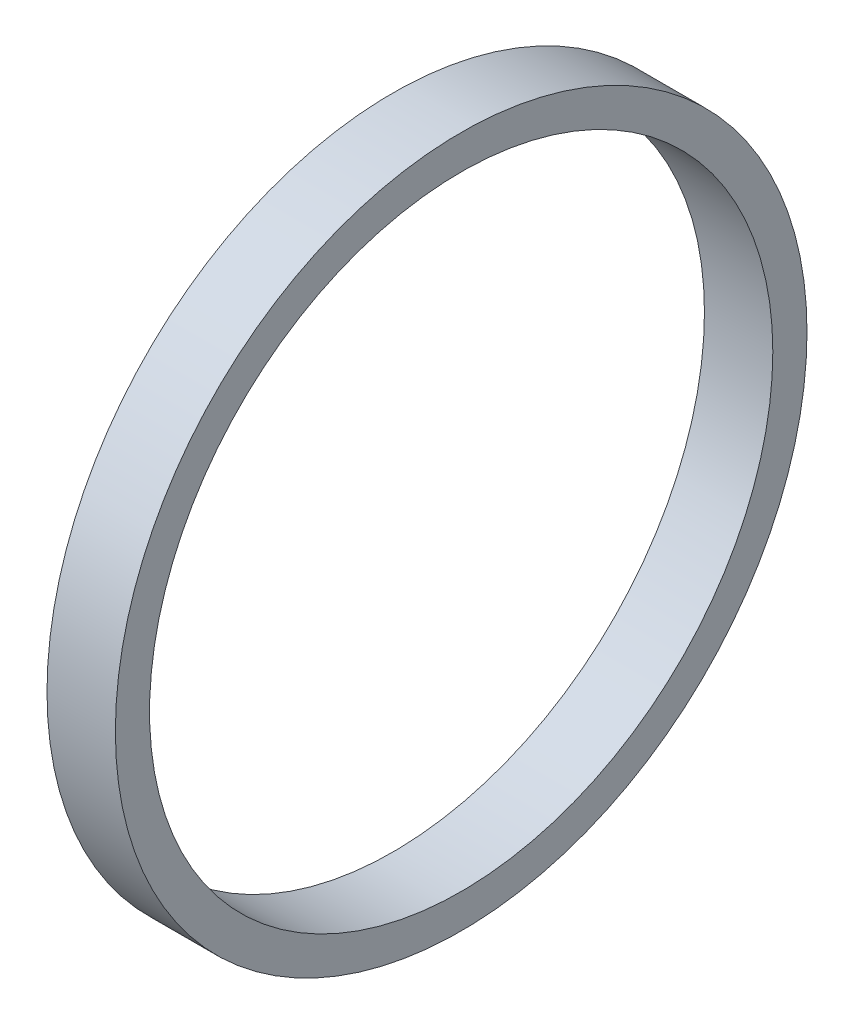
ISO-10303-21;
HEADER;
FILE_DESCRIPTION(('STEP AP214'),'2;1');
FILE_NAME('part.step','',(''),(''),'','','');
FILE_SCHEMA(('AUTOMOTIVE_DESIGN { 1 0 10303 214 1 1 1 1 }'));
ENDSEC;
DATA;
#1=APPLICATION_CONTEXT('core data for automotive mechanical design processes');
#2=APPLICATION_PROTOCOL_DEFINITION('international standard','automotive_design',2000,#1);
#3=PRODUCT_CONTEXT('',#1,'mechanical');
#4=PRODUCT('Part','Part','',(#3));
#5=PRODUCT_RELATED_PRODUCT_CATEGORY('part','',(#4));
#6=PRODUCT_DEFINITION_FORMATION('','',#4);
#7=PRODUCT_DEFINITION_CONTEXT('part definition',#1,'design');
#8=PRODUCT_DEFINITION('design','',#6,#7);
#9=PRODUCT_DEFINITION_SHAPE('','',#8);
#10=(LENGTH_UNIT() NAMED_UNIT(*) SI_UNIT(.MILLI.,.METRE.));
#11=(NAMED_UNIT(*) PLANE_ANGLE_UNIT() SI_UNIT($,.RADIAN.));
#12=(NAMED_UNIT(*) SI_UNIT($,.STERADIAN.) SOLID_ANGLE_UNIT());
#13=UNCERTAINTY_MEASURE_WITH_UNIT(LENGTH_MEASURE(1.E-05),#10,'distance_accuracy_value','');
#14=(GEOMETRIC_REPRESENTATION_CONTEXT(3) GLOBAL_UNCERTAINTY_ASSIGNED_CONTEXT((#13)) GLOBAL_UNIT_ASSIGNED_CONTEXT((#10,
#11,#12)) REPRESENTATION_CONTEXT('',''));
#15=CARTESIAN_POINT('',(0.,0.,0.));
#16=DIRECTION('',(0.,0.,1.));
#17=DIRECTION('',(1.,0.,0.));
#18=AXIS2_PLACEMENT_3D('',#15,#16,#17);
#19=CARTESIAN_POINT('',(-613.283297965054,0.,0.));
#20=DIRECTION('',(1.,0.,0.));
#21=DIRECTION('',(0.,0.,-1.));
#22=AXIS2_PLACEMENT_3D('',#19,#20,#21);
#23=CYLINDRICAL_SURFACE('',#22,30.35);
#24=CARTESIAN_POINT('',(-613.283297965054,0.,0.));
#25=DIRECTION('',(1.,0.,0.));
#26=DIRECTION('',(0.,0.,-1.));
#27=AXIS2_PLACEMENT_3D('',#24,#25,#26);
#28=CIRCLE('',#27,30.35);
#29=CARTESIAN_POINT('',(-613.283297965054,0.,-30.35));
#30=VERTEX_POINT('',#29);
#31=EDGE_CURVE('E10',#30,#30,#28,.T.);
#32=ORIENTED_EDGE('',*,*,#31,.T.);
#33=EDGE_LOOP('',(#32));
#34=FACE_BOUND('',#33,.T.);
#35=CARTESIAN_POINT('',(-607.283297965054,0.,0.));
#36=DIRECTION('',(1.,0.,0.));
#37=DIRECTION('',(0.,0.,-1.));
#38=AXIS2_PLACEMENT_3D('',#35,#36,#37);
#39=CIRCLE('',#38,30.35);
#40=CARTESIAN_POINT('',(-607.283297965054,0.,-30.35));
#41=VERTEX_POINT('',#40);
#42=EDGE_CURVE('E34',#41,#41,#39,.T.);
#43=ORIENTED_EDGE('',*,*,#42,.F.);
#44=EDGE_LOOP('',(#43));
#45=FACE_BOUND('',#44,.T.);
#46=ADVANCED_FACE('F31',(#34,#45),#23,.T.);
#47=CARTESIAN_POINT('',(-613.283297965054,0.,0.));
#48=DIRECTION('',(1.,0.,0.));
#49=DIRECTION('',(0.,0.,-1.));
#50=AXIS2_PLACEMENT_3D('',#47,#48,#49);
#51=PLANE('',#50);
#52=CARTESIAN_POINT('',(-613.283297965054,0.,0.));
#53=DIRECTION('',(1.,0.,0.));
#54=DIRECTION('',(0.,0.,-1.));
#55=AXIS2_PLACEMENT_3D('',#52,#53,#54);
#56=CIRCLE('',#55,27.35);
#57=CARTESIAN_POINT('',(-613.283297965054,0.,-27.35));
#58=VERTEX_POINT('',#57);
#59=EDGE_CURVE('E41',#58,#58,#56,.T.);
#60=ORIENTED_EDGE('',*,*,#59,.T.);
#61=EDGE_LOOP('',(#60));
#62=FACE_BOUND('',#61,.T.);
#63=ORIENTED_EDGE('',*,*,#31,.F.);
#64=EDGE_LOOP('',(#63));
#65=FACE_BOUND('',#64,.T.);
#66=ADVANCED_FACE('F49',(#62,#65),#51,.F.);
#67=CARTESIAN_POINT('',(-607.283297965054,0.,0.));
#68=DIRECTION('',(1.,0.,0.));
#69=DIRECTION('',(0.,0.,-1.));
#70=AXIS2_PLACEMENT_3D('',#67,#68,#69);
#71=PLANE('',#70);
#72=CARTESIAN_POINT('',(-607.283297965054,0.,0.));
#73=DIRECTION('',(1.,0.,0.));
#74=DIRECTION('',(0.,0.,-1.));
#75=AXIS2_PLACEMENT_3D('',#72,#73,#74);
#76=CIRCLE('',#75,27.35);
#77=CARTESIAN_POINT('',(-607.283297965054,0.,-27.35));
#78=VERTEX_POINT('',#77);
#79=EDGE_CURVE('E43',#78,#78,#76,.T.);
#80=ORIENTED_EDGE('',*,*,#79,.F.);
#81=EDGE_LOOP('',(#80));
#82=FACE_BOUND('',#81,.T.);
#83=ORIENTED_EDGE('',*,*,#42,.T.);
#84=EDGE_LOOP('',(#83));
#85=FACE_BOUND('',#84,.T.);
#86=ADVANCED_FACE('F55',(#82,#85),#71,.T.);
#87=CARTESIAN_POINT('',(-613.283297965054,0.,0.));
#88=DIRECTION('',(1.,0.,0.));
#89=DIRECTION('',(0.,0.,-1.));
#90=AXIS2_PLACEMENT_3D('',#87,#88,#89);
#91=CYLINDRICAL_SURFACE('',#90,27.35);
#92=ORIENTED_EDGE('',*,*,#59,.F.);
#93=EDGE_LOOP('',(#92));
#94=FACE_BOUND('',#93,.T.);
#95=ORIENTED_EDGE('',*,*,#79,.T.);
#96=EDGE_LOOP('',(#95));
#97=FACE_BOUND('',#96,.T.);
#98=ADVANCED_FACE('F52',(#94,#97),#91,.F.);
#99=CLOSED_SHELL('',(#46,#66,#86,#98));
#100=MANIFOLD_SOLID_BREP('B2',#99);
#101=ADVANCED_BREP_SHAPE_REPRESENTATION('',(#18,#100),#14);
#102=SHAPE_DEFINITION_REPRESENTATION(#9,#101);
ENDSEC;
END-ISO-10303-21;
